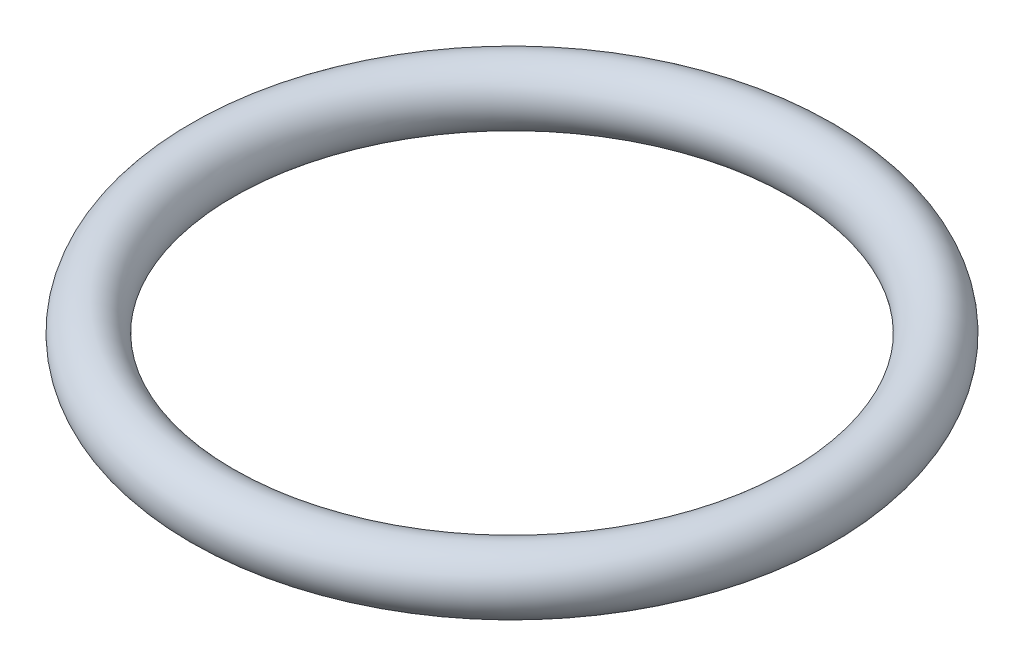
ISO-10303-21;
HEADER;
FILE_DESCRIPTION(('STEP AP214'),'2;1');
FILE_NAME('part.step','',(''),(''),'','','');
FILE_SCHEMA(('AUTOMOTIVE_DESIGN { 1 0 10303 214 1 1 1 1 }'));
ENDSEC;
DATA;
#1=APPLICATION_CONTEXT('core data for automotive mechanical design processes');
#2=APPLICATION_PROTOCOL_DEFINITION('international standard','automotive_design',2000,#1);
#3=PRODUCT_CONTEXT('',#1,'mechanical');
#4=PRODUCT('Part','Part','',(#3));
#5=PRODUCT_RELATED_PRODUCT_CATEGORY('part','',(#4));
#6=PRODUCT_DEFINITION_FORMATION('','',#4);
#7=PRODUCT_DEFINITION_CONTEXT('part definition',#1,'design');
#8=PRODUCT_DEFINITION('design','',#6,#7);
#9=PRODUCT_DEFINITION_SHAPE('','',#8);
#10=(LENGTH_UNIT() NAMED_UNIT(*) SI_UNIT(.MILLI.,.METRE.));
#11=(NAMED_UNIT(*) PLANE_ANGLE_UNIT() SI_UNIT($,.RADIAN.));
#12=(NAMED_UNIT(*) SI_UNIT($,.STERADIAN.) SOLID_ANGLE_UNIT());
#13=UNCERTAINTY_MEASURE_WITH_UNIT(LENGTH_MEASURE(1.E-05),#10,'distance_accuracy_value','');
#14=(GEOMETRIC_REPRESENTATION_CONTEXT(3) GLOBAL_UNCERTAINTY_ASSIGNED_CONTEXT((#13)) GLOBAL_UNIT_ASSIGNED_CONTEXT((#10,
#11,#12)) REPRESENTATION_CONTEXT('',''));
#15=CARTESIAN_POINT('',(0.,0.,0.));
#16=DIRECTION('',(0.,0.,1.));
#17=DIRECTION('',(1.,0.,0.));
#18=AXIS2_PLACEMENT_3D('',#15,#16,#17);
#19=CARTESIAN_POINT('',(0.,0.,0.));
#20=DIRECTION('',(0.,1.,0.));
#21=DIRECTION('',(0.,0.,1.));
#22=AXIS2_PLACEMENT_3D('',#19,#20,#21);
#23=TOROIDAL_SURFACE('',#22,5.,0.5);
#24=CARTESIAN_POINT('',(0.,0.,5.5));
#25=VERTEX_POINT('',#24);
#26=VERTEX_LOOP('',#25);
#27=FACE_BOUND('',#26,.T.);
#28=ADVANCED_FACE('F33',(#27),#23,.T.);
#29=CLOSED_SHELL('',(#28));
#30=MANIFOLD_SOLID_BREP('B2',#29);
#31=ADVANCED_BREP_SHAPE_REPRESENTATION('',(#18,#30),#14);
#32=SHAPE_DEFINITION_REPRESENTATION(#9,#31);
ENDSEC;
END-ISO-10303-21;
